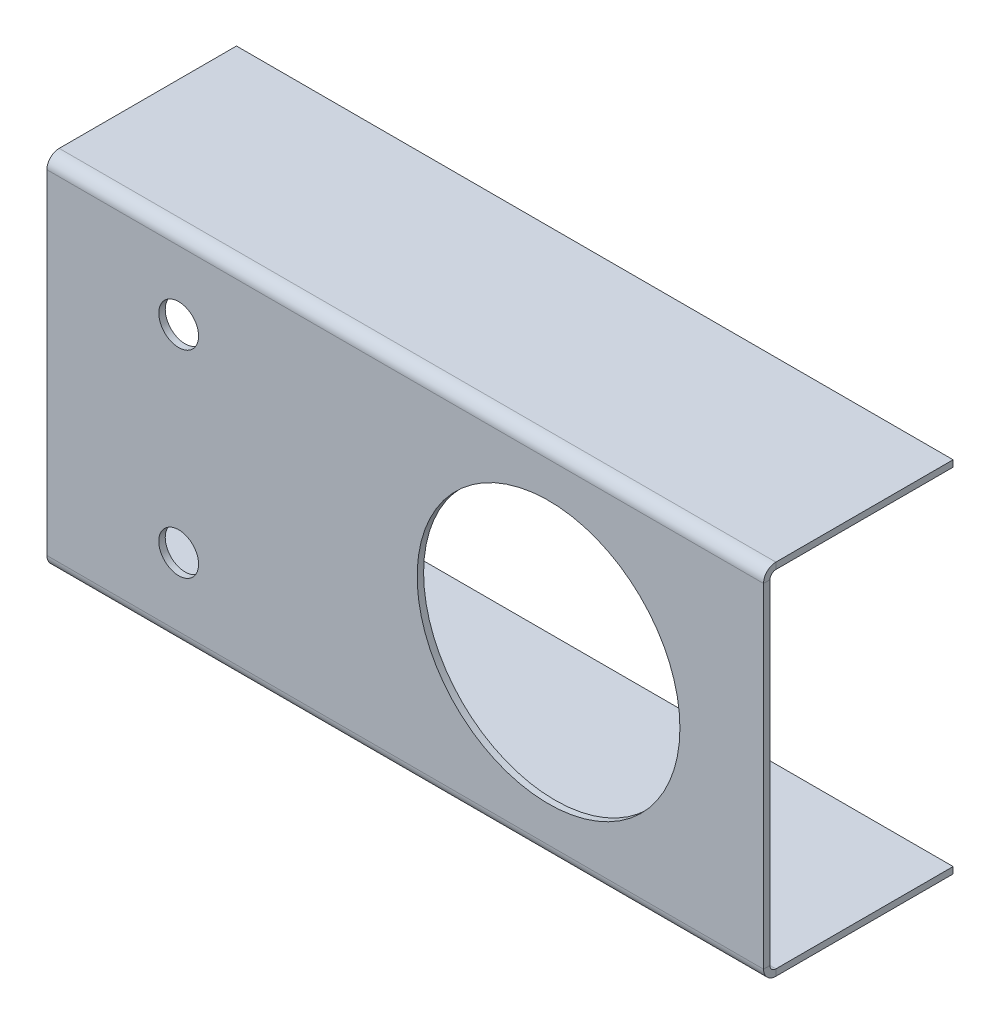
ISO-10303-21;
HEADER;
FILE_DESCRIPTION(('STEP AP214'),'2;1');
FILE_NAME('part.step','',(''),(''),'','','');
FILE_SCHEMA(('AUTOMOTIVE_DESIGN { 1 0 10303 214 1 1 1 1 }'));
ENDSEC;
DATA;
#1=APPLICATION_CONTEXT('core data for automotive mechanical design processes');
#2=APPLICATION_PROTOCOL_DEFINITION('international standard','automotive_design',2000,#1);
#3=PRODUCT_CONTEXT('',#1,'mechanical');
#4=PRODUCT('Part','Part','',(#3));
#5=PRODUCT_RELATED_PRODUCT_CATEGORY('part','',(#4));
#6=PRODUCT_DEFINITION_FORMATION('','',#4);
#7=PRODUCT_DEFINITION_CONTEXT('part definition',#1,'design');
#8=PRODUCT_DEFINITION('design','',#6,#7);
#9=PRODUCT_DEFINITION_SHAPE('','',#8);
#10=(LENGTH_UNIT() NAMED_UNIT(*) SI_UNIT(.MILLI.,.METRE.));
#11=(NAMED_UNIT(*) PLANE_ANGLE_UNIT() SI_UNIT($,.RADIAN.));
#12=(NAMED_UNIT(*) SI_UNIT($,.STERADIAN.) SOLID_ANGLE_UNIT());
#13=UNCERTAINTY_MEASURE_WITH_UNIT(LENGTH_MEASURE(1.E-05),#10,'distance_accuracy_value','');
#14=(GEOMETRIC_REPRESENTATION_CONTEXT(3) GLOBAL_UNCERTAINTY_ASSIGNED_CONTEXT((#13)) GLOBAL_UNIT_ASSIGNED_CONTEXT((#10,
#11,#12)) REPRESENTATION_CONTEXT('',''));
#15=CARTESIAN_POINT('',(0.,0.,0.));
#16=DIRECTION('',(0.,0.,1.));
#17=DIRECTION('',(1.,0.,0.));
#18=AXIS2_PLACEMENT_3D('',#15,#16,#17);
#19=CARTESIAN_POINT('',(0.,0.,-0.81));
#20=DIRECTION('',(0.,0.,-1.));
#21=DIRECTION('',(-1.,0.,0.));
#22=AXIS2_PLACEMENT_3D('',#19,#20,#21);
#23=PLANE('',#22);
#24=CARTESIAN_POINT('',(16.55327865,34.93,-0.81));
#25=DIRECTION('',(0.,0.,-1.));
#26=DIRECTION('',(-1.,0.,0.));
#27=AXIS2_PLACEMENT_3D('',#24,#25,#26);
#28=CIRCLE('',#27,2.5);
#29=CARTESIAN_POINT('',(14.05327865,34.93,-0.81));
#30=VERTEX_POINT('',#29);
#31=EDGE_CURVE('E386',#30,#30,#28,.T.);
#32=ORIENTED_EDGE('',*,*,#31,.F.);
#33=EDGE_LOOP('',(#32));
#34=FACE_BOUND('',#33,.T.);
#35=CARTESIAN_POINT('',(16.55327865,10.12,-0.81));
#36=DIRECTION('',(0.,0.,-1.));
#37=DIRECTION('',(-1.,0.,0.));
#38=AXIS2_PLACEMENT_3D('',#35,#36,#37);
#39=CIRCLE('',#38,2.5);
#40=CARTESIAN_POINT('',(14.05327865,10.12,-0.81));
#41=VERTEX_POINT('',#40);
#42=EDGE_CURVE('E380',#41,#41,#39,.T.);
#43=ORIENTED_EDGE('',*,*,#42,.F.);
#44=EDGE_LOOP('',(#43));
#45=FACE_BOUND('',#44,.T.);
#46=CARTESIAN_POINT('',(63.,22.525,-0.81));
#47=DIRECTION('',(0.,0.,-1.));
#48=DIRECTION('',(-1.,0.,0.));
#49=AXIS2_PLACEMENT_3D('',#46,#47,#48);
#50=CIRCLE('',#49,16.5);
#51=CARTESIAN_POINT('',(46.4999999999999,22.525,-0.81));
#52=VERTEX_POINT('',#51);
#53=EDGE_CURVE('E226',#52,#52,#50,.T.);
#54=ORIENTED_EDGE('',*,*,#53,.F.);
#55=EDGE_LOOP('',(#54));
#56=FACE_BOUND('',#55,.T.);
#57=DIRECTION('',(0.,1.,0.));
#58=VECTOR('',#57,1.);
#59=CARTESIAN_POINT('',(90.,0.,-0.81));
#60=LINE('',#59,#58);
#61=CARTESIAN_POINT('',(90.,1.5466,-0.81));
#62=VERTEX_POINT('',#61);
#63=CARTESIAN_POINT('',(90.,43.5034,-0.81));
#64=VERTEX_POINT('',#63);
#65=EDGE_CURVE('E13',#62,#64,#60,.T.);
#66=ORIENTED_EDGE('',*,*,#65,.F.);
#67=DIRECTION('',(-1.,0.,0.));
#68=VECTOR('',#67,1.);
#69=CARTESIAN_POINT('',(0.,1.5466,-0.81));
#70=LINE('',#69,#68);
#71=CARTESIAN_POINT('',(0.,1.5466,-0.81));
#72=VERTEX_POINT('',#71);
#73=EDGE_CURVE('E233',#72,#62,#70,.F.);
#74=ORIENTED_EDGE('',*,*,#73,.F.);
#75=DIRECTION('',(0.,-1.,0.));
#76=VECTOR('',#75,1.);
#77=CARTESIAN_POINT('',(0.,0.,-0.81));
#78=LINE('',#77,#76);
#79=CARTESIAN_POINT('',(0.,43.5034,-0.81));
#80=VERTEX_POINT('',#79);
#81=EDGE_CURVE('E88',#80,#72,#78,.T.);
#82=ORIENTED_EDGE('',*,*,#81,.F.);
#83=DIRECTION('',(1.,0.,0.));
#84=VECTOR('',#83,1.);
#85=CARTESIAN_POINT('',(90.,43.5034,-0.810000000000001));
#86=LINE('',#85,#84);
#87=EDGE_CURVE('E287',#64,#80,#86,.F.);
#88=ORIENTED_EDGE('',*,*,#87,.F.);
#89=EDGE_LOOP('',(#66,#74,#82,#88));
#90=FACE_BOUND('',#89,.T.);
#91=ADVANCED_FACE('F79',(#34,#45,#56,#90),#23,.T.);
#92=CARTESIAN_POINT('',(0.,0.,0.));
#93=DIRECTION('',(0.,0.,-1.));
#94=DIRECTION('',(-1.,0.,0.));
#95=AXIS2_PLACEMENT_3D('',#92,#93,#94);
#96=PLANE('',#95);
#97=CARTESIAN_POINT('',(16.55327865,34.93,0.));
#98=DIRECTION('',(0.,0.,1.));
#99=DIRECTION('',(1.,0.,0.));
#100=AXIS2_PLACEMENT_3D('',#97,#98,#99);
#101=CIRCLE('',#100,2.5);
#102=CARTESIAN_POINT('',(19.05327865,34.93,0.));
#103=VERTEX_POINT('',#102);
#104=EDGE_CURVE('E389',#103,#103,#101,.T.);
#105=ORIENTED_EDGE('',*,*,#104,.F.);
#106=EDGE_LOOP('',(#105));
#107=FACE_BOUND('',#106,.T.);
#108=CARTESIAN_POINT('',(16.55327865,10.12,0.));
#109=DIRECTION('',(0.,0.,1.));
#110=DIRECTION('',(1.,0.,0.));
#111=AXIS2_PLACEMENT_3D('',#108,#109,#110);
#112=CIRCLE('',#111,2.5);
#113=CARTESIAN_POINT('',(19.05327865,10.12,0.));
#114=VERTEX_POINT('',#113);
#115=EDGE_CURVE('E383',#114,#114,#112,.T.);
#116=ORIENTED_EDGE('',*,*,#115,.F.);
#117=EDGE_LOOP('',(#116));
#118=FACE_BOUND('',#117,.T.);
#119=CARTESIAN_POINT('',(63.,22.525,0.));
#120=DIRECTION('',(0.,0.,1.));
#121=DIRECTION('',(1.,0.,0.));
#122=AXIS2_PLACEMENT_3D('',#119,#120,#121);
#123=CIRCLE('',#122,16.5);
#124=CARTESIAN_POINT('',(79.5,22.525,0.));
#125=VERTEX_POINT('',#124);
#126=EDGE_CURVE('E377',#125,#125,#123,.T.);
#127=ORIENTED_EDGE('',*,*,#126,.F.);
#128=EDGE_LOOP('',(#127));
#129=FACE_BOUND('',#128,.T.);
#130=DIRECTION('',(-1.,0.,0.));
#131=VECTOR('',#130,1.);
#132=CARTESIAN_POINT('',(0.,1.5466,0.));
#133=LINE('',#132,#131);
#134=CARTESIAN_POINT('',(0.,1.5466,0.));
#135=VERTEX_POINT('',#134);
#136=CARTESIAN_POINT('',(90.,1.5466,0.));
#137=VERTEX_POINT('',#136);
#138=EDGE_CURVE('E178',#135,#137,#133,.F.);
#139=ORIENTED_EDGE('',*,*,#138,.T.);
#140=DIRECTION('',(0.,1.,0.));
#141=VECTOR('',#140,1.);
#142=CARTESIAN_POINT('',(90.,0.,0.));
#143=LINE('',#142,#141);
#144=CARTESIAN_POINT('',(90.,43.5034,0.));
#145=VERTEX_POINT('',#144);
#146=EDGE_CURVE('E83',#137,#145,#143,.T.);
#147=ORIENTED_EDGE('',*,*,#146,.T.);
#148=DIRECTION('',(1.,0.,0.));
#149=VECTOR('',#148,1.);
#150=CARTESIAN_POINT('',(90.,43.5034,0.));
#151=LINE('',#150,#149);
#152=CARTESIAN_POINT('',(0.,43.5034,0.));
#153=VERTEX_POINT('',#152);
#154=EDGE_CURVE('E275',#145,#153,#151,.F.);
#155=ORIENTED_EDGE('',*,*,#154,.T.);
#156=DIRECTION('',(0.,-1.,0.));
#157=VECTOR('',#156,1.);
#158=CARTESIAN_POINT('',(0.,0.,0.));
#159=LINE('',#158,#157);
#160=EDGE_CURVE('E293',#153,#135,#159,.T.);
#161=ORIENTED_EDGE('',*,*,#160,.T.);
#162=EDGE_LOOP('',(#139,#147,#155,#161));
#163=FACE_BOUND('',#162,.T.);
#164=ADVANCED_FACE('F297',(#107,#118,#129,#163),#96,.F.);
#165=CARTESIAN_POINT('',(0.,0.,-0.81));
#166=DIRECTION('',(-1.,0.,0.));
#167=DIRECTION('',(0.,0.,1.));
#168=AXIS2_PLACEMENT_3D('',#165,#166,#167);
#169=PLANE('',#168);
#170=ORIENTED_EDGE('',*,*,#81,.T.);
#171=DIRECTION('',(0.,0.,1.));
#172=VECTOR('',#171,1.);
#173=CARTESIAN_POINT('',(0.,1.5466,-0.81));
#174=LINE('',#173,#172);
#175=EDGE_CURVE('E229',#72,#135,#174,.T.);
#176=ORIENTED_EDGE('',*,*,#175,.T.);
#177=ORIENTED_EDGE('',*,*,#160,.F.);
#178=DIRECTION('',(0.,0.,1.));
#179=VECTOR('',#178,1.);
#180=CARTESIAN_POINT('',(0.,43.5034,-0.810000000000001));
#181=LINE('',#180,#179);
#182=EDGE_CURVE('E102',#80,#153,#181,.T.);
#183=ORIENTED_EDGE('',*,*,#182,.F.);
#184=EDGE_LOOP('',(#170,#176,#177,#183));
#185=FACE_BOUND('',#184,.T.);
#186=ADVANCED_FACE('F81',(#185),#169,.T.);
#187=CARTESIAN_POINT('',(90.,0.,-0.81));
#188=DIRECTION('',(1.,0.,0.));
#189=DIRECTION('',(0.,0.,-1.));
#190=AXIS2_PLACEMENT_3D('',#187,#188,#189);
#191=PLANE('',#190);
#192=DIRECTION('',(0.,0.,1.));
#193=VECTOR('',#192,1.);
#194=CARTESIAN_POINT('',(90.,1.5466,-0.81));
#195=LINE('',#194,#193);
#196=EDGE_CURVE('E237',#62,#137,#195,.T.);
#197=ORIENTED_EDGE('',*,*,#196,.F.);
#198=ORIENTED_EDGE('',*,*,#65,.T.);
#199=DIRECTION('',(0.,0.,1.));
#200=VECTOR('',#199,1.);
#201=CARTESIAN_POINT('',(90.,43.5034,-0.810000000000001));
#202=LINE('',#201,#200);
#203=EDGE_CURVE('E281',#64,#145,#202,.T.);
#204=ORIENTED_EDGE('',*,*,#203,.T.);
#205=ORIENTED_EDGE('',*,*,#146,.F.);
#206=EDGE_LOOP('',(#197,#198,#204,#205));
#207=FACE_BOUND('',#206,.T.);
#208=ADVANCED_FACE('F300',(#207),#191,.T.);
#209=CARTESIAN_POINT('',(0.,43.5034,-1.5466));
#210=DIRECTION('',(-1.,0.,0.));
#211=DIRECTION('',(0.,0.,1.));
#212=AXIS2_PLACEMENT_3D('',#209,#210,#211);
#213=PLANE('',#212);
#214=DIRECTION('',(0.,1.,0.));
#215=VECTOR('',#214,1.);
#216=CARTESIAN_POINT('',(0.,45.05,-1.54659999999999));
#217=LINE('',#216,#215);
#218=CARTESIAN_POINT('',(0.,44.24,-1.5466));
#219=VERTEX_POINT('',#218);
#220=CARTESIAN_POINT('',(0.,45.05,-1.54659999999999));
#221=VERTEX_POINT('',#220);
#222=EDGE_CURVE('E240',#219,#221,#217,.T.);
#223=ORIENTED_EDGE('',*,*,#222,.F.);
#224=CARTESIAN_POINT('',(0.,43.5034,-1.5466));
#225=DIRECTION('',(1.,0.,0.));
#226=DIRECTION('',(0.,0.,-1.));
#227=AXIS2_PLACEMENT_3D('',#224,#225,#226);
#228=CIRCLE('',#227,0.736599999999997);
#229=EDGE_CURVE('E284',#80,#219,#228,.F.);
#230=ORIENTED_EDGE('',*,*,#229,.F.);
#231=ORIENTED_EDGE('',*,*,#182,.T.);
#232=CARTESIAN_POINT('',(0.,43.5034,-1.5466));
#233=DIRECTION('',(1.,0.,0.));
#234=DIRECTION('',(0.,0.,-1.));
#235=AXIS2_PLACEMENT_3D('',#232,#233,#234);
#236=CIRCLE('',#235,1.5466);
#237=EDGE_CURVE('E277',#153,#221,#236,.F.);
#238=ORIENTED_EDGE('',*,*,#237,.T.);
#239=EDGE_LOOP('',(#223,#230,#231,#238));
#240=FACE_BOUND('',#239,.T.);
#241=ADVANCED_FACE('F325',(#240),#213,.T.);
#242=CARTESIAN_POINT('',(90.,43.5034,-1.5466));
#243=DIRECTION('',(-1.,0.,0.));
#244=DIRECTION('',(0.,0.,1.));
#245=AXIS2_PLACEMENT_3D('',#242,#243,#244);
#246=PLANE('',#245);
#247=CARTESIAN_POINT('',(90.,43.5034,-1.5466));
#248=DIRECTION('',(1.,0.,0.));
#249=DIRECTION('',(0.,0.,-1.));
#250=AXIS2_PLACEMENT_3D('',#247,#248,#249);
#251=CIRCLE('',#250,0.736599999999997);
#252=CARTESIAN_POINT('',(90.,44.24,-1.5466));
#253=VERTEX_POINT('',#252);
#254=EDGE_CURVE('E245',#253,#64,#251,.T.);
#255=ORIENTED_EDGE('',*,*,#254,.F.);
#256=DIRECTION('',(0.,1.,0.));
#257=VECTOR('',#256,1.);
#258=CARTESIAN_POINT('',(90.,44.24,-1.5466));
#259=LINE('',#258,#257);
#260=CARTESIAN_POINT('',(90.,45.05,-1.54659999999999));
#261=VERTEX_POINT('',#260);
#262=EDGE_CURVE('E268',#253,#261,#259,.T.);
#263=ORIENTED_EDGE('',*,*,#262,.T.);
#264=CARTESIAN_POINT('',(90.,43.5034,-1.5466));
#265=DIRECTION('',(1.,0.,0.));
#266=DIRECTION('',(0.,0.,-1.));
#267=AXIS2_PLACEMENT_3D('',#264,#265,#266);
#268=CIRCLE('',#267,1.5466);
#269=EDGE_CURVE('E278',#261,#145,#268,.T.);
#270=ORIENTED_EDGE('',*,*,#269,.T.);
#271=ORIENTED_EDGE('',*,*,#203,.F.);
#272=EDGE_LOOP('',(#255,#263,#270,#271));
#273=FACE_BOUND('',#272,.T.);
#274=ADVANCED_FACE('F306',(#273),#246,.F.);
#275=CARTESIAN_POINT('',(90.,43.5034,-1.5466));
#276=DIRECTION('',(1.,0.,0.));
#277=DIRECTION('',(0.,1.,0.));
#278=AXIS2_PLACEMENT_3D('',#275,#276,#277);
#279=CYLINDRICAL_SURFACE('',#278,1.5466);
#280=ORIENTED_EDGE('',*,*,#154,.F.);
#281=ORIENTED_EDGE('',*,*,#269,.F.);
#282=DIRECTION('',(1.,0.,0.));
#283=VECTOR('',#282,1.);
#284=CARTESIAN_POINT('',(0.,45.05,-1.54659999999999));
#285=LINE('',#284,#283);
#286=EDGE_CURVE('E265',#221,#261,#285,.T.);
#287=ORIENTED_EDGE('',*,*,#286,.F.);
#288=ORIENTED_EDGE('',*,*,#237,.F.);
#289=EDGE_LOOP('',(#280,#281,#287,#288));
#290=FACE_BOUND('',#289,.T.);
#291=ADVANCED_FACE('F305',(#290),#279,.T.);
#292=CARTESIAN_POINT('',(90.,43.5034,-1.5466));
#293=DIRECTION('',(1.,0.,0.));
#294=DIRECTION('',(0.,1.,0.));
#295=AXIS2_PLACEMENT_3D('',#292,#293,#294);
#296=CYLINDRICAL_SURFACE('',#295,0.736599999999997);
#297=ORIENTED_EDGE('',*,*,#87,.T.);
#298=ORIENTED_EDGE('',*,*,#229,.T.);
#299=DIRECTION('',(-1.,0.,0.));
#300=VECTOR('',#299,1.);
#301=CARTESIAN_POINT('',(0.,44.24,-1.5466));
#302=LINE('',#301,#300);
#303=EDGE_CURVE('E271',#219,#253,#302,.F.);
#304=ORIENTED_EDGE('',*,*,#303,.T.);
#305=ORIENTED_EDGE('',*,*,#254,.T.);
#306=EDGE_LOOP('',(#297,#298,#304,#305));
#307=FACE_BOUND('',#306,.T.);
#308=ADVANCED_FACE('F328',(#307),#296,.F.);
#309=CARTESIAN_POINT('',(90.,45.05,-0.809999999999997));
#310=DIRECTION('',(1.,0.,0.));
#311=DIRECTION('',(0.,0.,-1.));
#312=AXIS2_PLACEMENT_3D('',#309,#310,#311);
#313=PLANE('',#312);
#314=DIRECTION('',(0.,0.,1.));
#315=VECTOR('',#314,1.);
#316=CARTESIAN_POINT('',(90.,45.05,-0.809999999999997));
#317=LINE('',#316,#315);
#318=CARTESIAN_POINT('',(90.,45.0500000000001,-23.81));
#319=VERTEX_POINT('',#318);
#320=EDGE_CURVE('E249',#319,#261,#317,.T.);
#321=ORIENTED_EDGE('',*,*,#320,.T.);
#322=ORIENTED_EDGE('',*,*,#262,.F.);
#323=DIRECTION('',(0.,0.,-1.));
#324=VECTOR('',#323,1.);
#325=CARTESIAN_POINT('',(90.,44.24,1.6309417584575E-13));
#326=LINE('',#325,#324);
#327=CARTESIAN_POINT('',(90.,44.2400000000001,-23.81));
#328=VERTEX_POINT('',#327);
#329=EDGE_CURVE('E257',#328,#253,#326,.F.);
#330=ORIENTED_EDGE('',*,*,#329,.F.);
#331=DIRECTION('',(0.,-1.,0.));
#332=VECTOR('',#331,1.);
#333=CARTESIAN_POINT('',(90.,45.0500000000001,-23.81));
#334=LINE('',#333,#332);
#335=EDGE_CURVE('E243',#319,#328,#334,.T.);
#336=ORIENTED_EDGE('',*,*,#335,.F.);
#337=EDGE_LOOP('',(#321,#322,#330,#336));
#338=FACE_BOUND('',#337,.T.);
#339=ADVANCED_FACE('F315',(#338),#313,.T.);
#340=CARTESIAN_POINT('',(0.,45.0500000000001,-23.81));
#341=DIRECTION('',(-1.,0.,0.));
#342=DIRECTION('',(0.,0.,1.));
#343=AXIS2_PLACEMENT_3D('',#340,#341,#342);
#344=PLANE('',#343);
#345=DIRECTION('',(0.,0.,1.));
#346=VECTOR('',#345,1.);
#347=CARTESIAN_POINT('',(0.,44.24,1.6309417584575E-13));
#348=LINE('',#347,#346);
#349=CARTESIAN_POINT('',(0.,44.2400000000001,-23.81));
#350=VERTEX_POINT('',#349);
#351=EDGE_CURVE('E263',#219,#350,#348,.F.);
#352=ORIENTED_EDGE('',*,*,#351,.F.);
#353=ORIENTED_EDGE('',*,*,#222,.T.);
#354=DIRECTION('',(0.,0.,-1.));
#355=VECTOR('',#354,1.);
#356=CARTESIAN_POINT('',(0.,45.0500000000001,-23.81));
#357=LINE('',#356,#355);
#358=CARTESIAN_POINT('',(0.,45.0500000000001,-23.81));
#359=VERTEX_POINT('',#358);
#360=EDGE_CURVE('E255',#221,#359,#357,.T.);
#361=ORIENTED_EDGE('',*,*,#360,.T.);
#362=DIRECTION('',(0.,-1.,0.));
#363=VECTOR('',#362,1.);
#364=CARTESIAN_POINT('',(0.,45.0500000000001,-23.81));
#365=LINE('',#364,#363);
#366=EDGE_CURVE('E246',#359,#350,#365,.T.);
#367=ORIENTED_EDGE('',*,*,#366,.T.);
#368=EDGE_LOOP('',(#352,#353,#361,#367));
#369=FACE_BOUND('',#368,.T.);
#370=ADVANCED_FACE('F322',(#369),#344,.T.);
#371=CARTESIAN_POINT('',(0.,45.05,1.65922275730213E-13));
#372=DIRECTION('',(0.,1.,0.));
#373=DIRECTION('',(0.,0.,1.));
#374=AXIS2_PLACEMENT_3D('',#371,#372,#373);
#375=PLANE('',#374);
#376=ORIENTED_EDGE('',*,*,#360,.F.);
#377=ORIENTED_EDGE('',*,*,#286,.T.);
#378=ORIENTED_EDGE('',*,*,#320,.F.);
#379=DIRECTION('',(1.,0.,0.));
#380=VECTOR('',#379,1.);
#381=CARTESIAN_POINT('',(90.,45.0500000000001,-23.81));
#382=LINE('',#381,#380);
#383=EDGE_CURVE('E252',#359,#319,#382,.T.);
#384=ORIENTED_EDGE('',*,*,#383,.F.);
#385=EDGE_LOOP('',(#376,#377,#378,#384));
#386=FACE_BOUND('',#385,.T.);
#387=ADVANCED_FACE('F313',(#386),#375,.T.);
#388=CARTESIAN_POINT('',(0.,44.24,1.6309417584575E-13));
#389=DIRECTION('',(0.,1.,0.));
#390=DIRECTION('',(0.,0.,1.));
#391=AXIS2_PLACEMENT_3D('',#388,#389,#390);
#392=PLANE('',#391);
#393=ORIENTED_EDGE('',*,*,#303,.F.);
#394=ORIENTED_EDGE('',*,*,#351,.T.);
#395=DIRECTION('',(-1.,0.,0.));
#396=VECTOR('',#395,1.);
#397=CARTESIAN_POINT('',(0.,44.2400000000001,-23.81));
#398=LINE('',#397,#396);
#399=EDGE_CURVE('E260',#350,#328,#398,.F.);
#400=ORIENTED_EDGE('',*,*,#399,.T.);
#401=ORIENTED_EDGE('',*,*,#329,.T.);
#402=EDGE_LOOP('',(#393,#394,#400,#401));
#403=FACE_BOUND('',#402,.T.);
#404=ADVANCED_FACE('F330',(#403),#392,.F.);
#405=CARTESIAN_POINT('',(90.,45.0500000000001,-23.81));
#406=DIRECTION('',(0.,0.,-1.));
#407=DIRECTION('',(0.,1.,0.));
#408=AXIS2_PLACEMENT_3D('',#405,#406,#407);
#409=PLANE('',#408);
#410=ORIENTED_EDGE('',*,*,#399,.F.);
#411=ORIENTED_EDGE('',*,*,#366,.F.);
#412=ORIENTED_EDGE('',*,*,#383,.T.);
#413=ORIENTED_EDGE('',*,*,#335,.T.);
#414=EDGE_LOOP('',(#410,#411,#412,#413));
#415=FACE_BOUND('',#414,.T.);
#416=ADVANCED_FACE('F319',(#415),#409,.T.);
#417=CARTESIAN_POINT('',(90.,1.5466,-1.5466));
#418=DIRECTION('',(1.,0.,0.));
#419=DIRECTION('',(0.,0.,-1.));
#420=AXIS2_PLACEMENT_3D('',#417,#418,#419);
#421=PLANE('',#420);
#422=DIRECTION('',(0.,-1.,0.));
#423=VECTOR('',#422,1.);
#424=CARTESIAN_POINT('',(90.,0.,-1.5466));
#425=LINE('',#424,#423);
#426=CARTESIAN_POINT('',(90.,0.809999999999997,-1.5466));
#427=VERTEX_POINT('',#426);
#428=CARTESIAN_POINT('',(89.9999999999999,0.,-1.54659999999999));
#429=VERTEX_POINT('',#428);
#430=EDGE_CURVE('E223',#427,#429,#425,.T.);
#431=ORIENTED_EDGE('',*,*,#430,.F.);
#432=CARTESIAN_POINT('',(90.,1.5466,-1.5466));
#433=DIRECTION('',(-1.,0.,0.));
#434=DIRECTION('',(0.,0.,1.));
#435=AXIS2_PLACEMENT_3D('',#432,#433,#434);
#436=CIRCLE('',#435,0.7366);
#437=EDGE_CURVE('E181',#62,#427,#436,.F.);
#438=ORIENTED_EDGE('',*,*,#437,.F.);
#439=ORIENTED_EDGE('',*,*,#196,.T.);
#440=CARTESIAN_POINT('',(89.9999999999999,1.5466,-1.5466));
#441=DIRECTION('',(-1.,0.,0.));
#442=DIRECTION('',(0.,0.,1.));
#443=AXIS2_PLACEMENT_3D('',#440,#441,#442);
#444=CIRCLE('',#443,1.5466);
#445=EDGE_CURVE('E228',#137,#429,#444,.F.);
#446=ORIENTED_EDGE('',*,*,#445,.T.);
#447=EDGE_LOOP('',(#431,#438,#439,#446));
#448=FACE_BOUND('',#447,.T.);
#449=ADVANCED_FACE('F337',(#448),#421,.T.);
#450=CARTESIAN_POINT('',(0.,1.5466,-1.5466));
#451=DIRECTION('',(1.,0.,0.));
#452=DIRECTION('',(0.,0.,-1.));
#453=AXIS2_PLACEMENT_3D('',#450,#451,#452);
#454=PLANE('',#453);
#455=CARTESIAN_POINT('',(0.,1.5466,-1.5466));
#456=DIRECTION('',(-1.,0.,0.));
#457=DIRECTION('',(0.,0.,1.));
#458=AXIS2_PLACEMENT_3D('',#455,#456,#457);
#459=CIRCLE('',#458,0.7366);
#460=CARTESIAN_POINT('',(0.,0.809999999999997,-1.5466));
#461=VERTEX_POINT('',#460);
#462=EDGE_CURVE('E188',#461,#72,#459,.T.);
#463=ORIENTED_EDGE('',*,*,#462,.F.);
#464=DIRECTION('',(0.,-1.,0.));
#465=VECTOR('',#464,1.);
#466=CARTESIAN_POINT('',(0.,0.809999999999997,-1.5466));
#467=LINE('',#466,#465);
#468=CARTESIAN_POINT('',(0.,0.,-1.54659999999999));
#469=VERTEX_POINT('',#468);
#470=EDGE_CURVE('E185',#461,#469,#467,.T.);
#471=ORIENTED_EDGE('',*,*,#470,.T.);
#472=CARTESIAN_POINT('',(0.,1.5466,-1.5466));
#473=DIRECTION('',(-1.,0.,0.));
#474=DIRECTION('',(0.,0.,1.));
#475=AXIS2_PLACEMENT_3D('',#472,#473,#474);
#476=CIRCLE('',#475,1.5466);
#477=EDGE_CURVE('E171',#469,#135,#476,.T.);
#478=ORIENTED_EDGE('',*,*,#477,.T.);
#479=ORIENTED_EDGE('',*,*,#175,.F.);
#480=EDGE_LOOP('',(#463,#471,#478,#479));
#481=FACE_BOUND('',#480,.T.);
#482=ADVANCED_FACE('F186',(#481),#454,.F.);
#483=CARTESIAN_POINT('',(0.,1.5466,-1.5466));
#484=DIRECTION('',(-1.,0.,0.));
#485=DIRECTION('',(0.,-1.,0.));
#486=AXIS2_PLACEMENT_3D('',#483,#484,#485);
#487=CYLINDRICAL_SURFACE('',#486,1.5466);
#488=ORIENTED_EDGE('',*,*,#138,.F.);
#489=ORIENTED_EDGE('',*,*,#477,.F.);
#490=DIRECTION('',(-1.,0.,0.));
#491=VECTOR('',#490,1.);
#492=CARTESIAN_POINT('',(0.,0.,-1.54659999999999));
#493=LINE('',#492,#491);
#494=EDGE_CURVE('E176',#429,#469,#493,.T.);
#495=ORIENTED_EDGE('',*,*,#494,.F.);
#496=ORIENTED_EDGE('',*,*,#445,.F.);
#497=EDGE_LOOP('',(#488,#489,#495,#496));
#498=FACE_BOUND('',#497,.T.);
#499=ADVANCED_FACE('F173',(#498),#487,.T.);
#500=CARTESIAN_POINT('',(0.,1.5466,-1.5466));
#501=DIRECTION('',(-1.,0.,0.));
#502=DIRECTION('',(0.,-1.,0.));
#503=AXIS2_PLACEMENT_3D('',#500,#501,#502);
#504=CYLINDRICAL_SURFACE('',#503,0.7366);
#505=ORIENTED_EDGE('',*,*,#73,.T.);
#506=ORIENTED_EDGE('',*,*,#437,.T.);
#507=DIRECTION('',(1.,0.,0.));
#508=VECTOR('',#507,1.);
#509=CARTESIAN_POINT('',(90.,0.809999999999997,-1.5466));
#510=LINE('',#509,#508);
#511=EDGE_CURVE('E193',#427,#461,#510,.F.);
#512=ORIENTED_EDGE('',*,*,#511,.T.);
#513=ORIENTED_EDGE('',*,*,#462,.T.);
#514=EDGE_LOOP('',(#505,#506,#512,#513));
#515=FACE_BOUND('',#514,.T.);
#516=ADVANCED_FACE('F362',(#515),#504,.F.);
#517=CARTESIAN_POINT('',(0.,0.,-0.809999999999997));
#518=DIRECTION('',(-1.,0.,0.));
#519=DIRECTION('',(0.,0.,1.));
#520=AXIS2_PLACEMENT_3D('',#517,#518,#519);
#521=PLANE('',#520);
#522=DIRECTION('',(0.,0.,1.));
#523=VECTOR('',#522,1.);
#524=CARTESIAN_POINT('',(0.,0.,-0.809999999999997));
#525=LINE('',#524,#523);
#526=CARTESIAN_POINT('',(0.,0.,-23.81));
#527=VERTEX_POINT('',#526);
#528=EDGE_CURVE('E200',#527,#469,#525,.T.);
#529=ORIENTED_EDGE('',*,*,#528,.T.);
#530=ORIENTED_EDGE('',*,*,#470,.F.);
#531=DIRECTION('',(0.,0.,-1.));
#532=VECTOR('',#531,1.);
#533=CARTESIAN_POINT('',(0.,0.810000000000003,0.));
#534=LINE('',#533,#532);
#535=CARTESIAN_POINT('',(0.,0.80999999999992,-23.81));
#536=VERTEX_POINT('',#535);
#537=EDGE_CURVE('E216',#536,#461,#534,.F.);
#538=ORIENTED_EDGE('',*,*,#537,.F.);
#539=DIRECTION('',(0.,1.,0.));
#540=VECTOR('',#539,1.);
#541=CARTESIAN_POINT('',(0.,0.,-23.81));
#542=LINE('',#541,#540);
#543=EDGE_CURVE('E205',#527,#536,#542,.T.);
#544=ORIENTED_EDGE('',*,*,#543,.F.);
#545=EDGE_LOOP('',(#529,#530,#538,#544));
#546=FACE_BOUND('',#545,.T.);
#547=ADVANCED_FACE('F204',(#546),#521,.T.);
#548=CARTESIAN_POINT('',(90.,0.,-23.81));
#549=DIRECTION('',(1.,0.,0.));
#550=DIRECTION('',(0.,0.,-1.));
#551=AXIS2_PLACEMENT_3D('',#548,#549,#550);
#552=PLANE('',#551);
#553=DIRECTION('',(0.,0.,1.));
#554=VECTOR('',#553,1.);
#555=CARTESIAN_POINT('',(90.,0.810000000000003,0.));
#556=LINE('',#555,#554);
#557=CARTESIAN_POINT('',(90.,0.80999999999992,-23.81));
#558=VERTEX_POINT('',#557);
#559=EDGE_CURVE('E202',#427,#558,#556,.F.);
#560=ORIENTED_EDGE('',*,*,#559,.F.);
#561=ORIENTED_EDGE('',*,*,#430,.T.);
#562=DIRECTION('',(0.,0.,-1.));
#563=VECTOR('',#562,1.);
#564=CARTESIAN_POINT('',(90.,0.,-23.81));
#565=LINE('',#564,#563);
#566=CARTESIAN_POINT('',(90.,0.,-23.81));
#567=VERTEX_POINT('',#566);
#568=EDGE_CURVE('E201',#429,#567,#565,.T.);
#569=ORIENTED_EDGE('',*,*,#568,.T.);
#570=DIRECTION('',(0.,1.,0.));
#571=VECTOR('',#570,1.);
#572=CARTESIAN_POINT('',(90.,0.,-23.81));
#573=LINE('',#572,#571);
#574=EDGE_CURVE('E207',#567,#558,#573,.T.);
#575=ORIENTED_EDGE('',*,*,#574,.T.);
#576=EDGE_LOOP('',(#560,#561,#569,#575));
#577=FACE_BOUND('',#576,.T.);
#578=ADVANCED_FACE('F369',(#577),#552,.T.);
#579=CARTESIAN_POINT('',(0.,0.,0.));
#580=DIRECTION('',(0.,-1.,0.));
#581=DIRECTION('',(0.,0.,-1.));
#582=AXIS2_PLACEMENT_3D('',#579,#580,#581);
#583=PLANE('',#582);
#584=ORIENTED_EDGE('',*,*,#568,.F.);
#585=ORIENTED_EDGE('',*,*,#494,.T.);
#586=ORIENTED_EDGE('',*,*,#528,.F.);
#587=DIRECTION('',(-1.,0.,0.));
#588=VECTOR('',#587,1.);
#589=CARTESIAN_POINT('',(0.,0.,-23.81));
#590=LINE('',#589,#588);
#591=EDGE_CURVE('E208',#567,#527,#590,.T.);
#592=ORIENTED_EDGE('',*,*,#591,.F.);
#593=EDGE_LOOP('',(#584,#585,#586,#592));
#594=FACE_BOUND('',#593,.T.);
#595=ADVANCED_FACE('F198',(#594),#583,.T.);
#596=CARTESIAN_POINT('',(0.,0.810000000000003,0.));
#597=DIRECTION('',(0.,-1.,0.));
#598=DIRECTION('',(0.,0.,-1.));
#599=AXIS2_PLACEMENT_3D('',#596,#597,#598);
#600=PLANE('',#599);
#601=ORIENTED_EDGE('',*,*,#511,.F.);
#602=ORIENTED_EDGE('',*,*,#559,.T.);
#603=DIRECTION('',(1.,0.,0.));
#604=VECTOR('',#603,1.);
#605=CARTESIAN_POINT('',(0.,0.80999999999992,-23.81));
#606=LINE('',#605,#604);
#607=EDGE_CURVE('E218',#558,#536,#606,.F.);
#608=ORIENTED_EDGE('',*,*,#607,.T.);
#609=ORIENTED_EDGE('',*,*,#537,.T.);
#610=EDGE_LOOP('',(#601,#602,#608,#609));
#611=FACE_BOUND('',#610,.T.);
#612=ADVANCED_FACE('F367',(#611),#600,.F.);
#613=CARTESIAN_POINT('',(0.,0.,-23.81));
#614=DIRECTION('',(0.,0.,-1.));
#615=DIRECTION('',(0.,1.,0.));
#616=AXIS2_PLACEMENT_3D('',#613,#614,#615);
#617=PLANE('',#616);
#618=ORIENTED_EDGE('',*,*,#607,.F.);
#619=ORIENTED_EDGE('',*,*,#574,.F.);
#620=ORIENTED_EDGE('',*,*,#591,.T.);
#621=ORIENTED_EDGE('',*,*,#543,.T.);
#622=EDGE_LOOP('',(#618,#619,#620,#621));
#623=FACE_BOUND('',#622,.T.);
#624=ADVANCED_FACE('F373',(#623),#617,.T.);
#625=CARTESIAN_POINT('',(63.,22.525,-10.));
#626=DIRECTION('',(0.,0.,1.));
#627=DIRECTION('',(1.,0.,0.));
#628=AXIS2_PLACEMENT_3D('',#625,#626,#627);
#629=CYLINDRICAL_SURFACE('',#628,16.5);
#630=ORIENTED_EDGE('',*,*,#53,.T.);
#631=EDGE_LOOP('',(#630));
#632=FACE_BOUND('',#631,.T.);
#633=ORIENTED_EDGE('',*,*,#126,.T.);
#634=EDGE_LOOP('',(#633));
#635=FACE_BOUND('',#634,.T.);
#636=ADVANCED_FACE('F399',(#632,#635),#629,.F.);
#637=CARTESIAN_POINT('',(16.55327865,10.12,-10.));
#638=DIRECTION('',(0.,0.,1.));
#639=DIRECTION('',(1.,0.,0.));
#640=AXIS2_PLACEMENT_3D('',#637,#638,#639);
#641=CYLINDRICAL_SURFACE('',#640,2.5);
#642=ORIENTED_EDGE('',*,*,#42,.T.);
#643=EDGE_LOOP('',(#642));
#644=FACE_BOUND('',#643,.T.);
#645=ORIENTED_EDGE('',*,*,#115,.T.);
#646=EDGE_LOOP('',(#645));
#647=FACE_BOUND('',#646,.T.);
#648=ADVANCED_FACE('F401',(#644,#647),#641,.F.);
#649=CARTESIAN_POINT('',(16.55327865,34.93,-10.));
#650=DIRECTION('',(0.,0.,1.));
#651=DIRECTION('',(1.,0.,0.));
#652=AXIS2_PLACEMENT_3D('',#649,#650,#651);
#653=CYLINDRICAL_SURFACE('',#652,2.5);
#654=ORIENTED_EDGE('',*,*,#31,.T.);
#655=EDGE_LOOP('',(#654));
#656=FACE_BOUND('',#655,.T.);
#657=ORIENTED_EDGE('',*,*,#104,.T.);
#658=EDGE_LOOP('',(#657));
#659=FACE_BOUND('',#658,.T.);
#660=ADVANCED_FACE('F393',(#656,#659),#653,.F.);
#661=CLOSED_SHELL('',(#91,#164,#186,#208,#241,#274,#291,#308,#339,#370,#387,#404,#416,#449,#482,
#499,#516,#547,#578,#595,#612,#624,#636,#648,#660));
#662=MANIFOLD_SOLID_BREP('B2',#661);
#663=ADVANCED_BREP_SHAPE_REPRESENTATION('',(#18,#662),#14);
#664=SHAPE_DEFINITION_REPRESENTATION(#9,#663);
ENDSEC;
END-ISO-10303-21;
